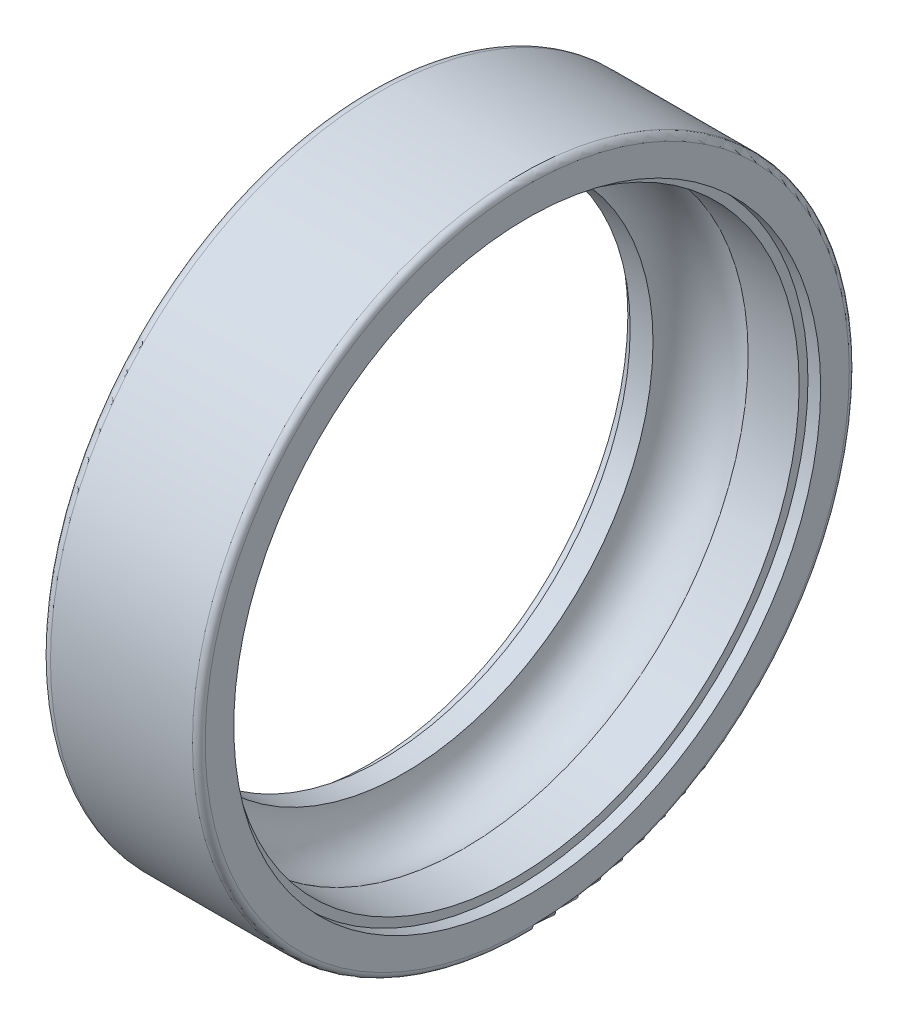
ISO-10303-21;
HEADER;
FILE_DESCRIPTION(('STEP AP214'),'2;1');
FILE_NAME('part.step','',(''),(''),'','','');
FILE_SCHEMA(('AUTOMOTIVE_DESIGN { 1 0 10303 214 1 1 1 1 }'));
ENDSEC;
DATA;
#1=APPLICATION_CONTEXT('core data for automotive mechanical design processes');
#2=APPLICATION_PROTOCOL_DEFINITION('international standard','automotive_design',2000,#1);
#3=PRODUCT_CONTEXT('',#1,'mechanical');
#4=PRODUCT('Part','Part','',(#3));
#5=PRODUCT_RELATED_PRODUCT_CATEGORY('part','',(#4));
#6=PRODUCT_DEFINITION_FORMATION('','',#4);
#7=PRODUCT_DEFINITION_CONTEXT('part definition',#1,'design');
#8=PRODUCT_DEFINITION('design','',#6,#7);
#9=PRODUCT_DEFINITION_SHAPE('','',#8);
#10=(LENGTH_UNIT() NAMED_UNIT(*) SI_UNIT(.MILLI.,.METRE.));
#11=(NAMED_UNIT(*) PLANE_ANGLE_UNIT() SI_UNIT($,.RADIAN.));
#12=(NAMED_UNIT(*) SI_UNIT($,.STERADIAN.) SOLID_ANGLE_UNIT());
#13=UNCERTAINTY_MEASURE_WITH_UNIT(LENGTH_MEASURE(1.E-05),#10,'distance_accuracy_value','');
#14=(GEOMETRIC_REPRESENTATION_CONTEXT(3) GLOBAL_UNCERTAINTY_ASSIGNED_CONTEXT((#13)) GLOBAL_UNIT_ASSIGNED_CONTEXT((#10,
#11,#12)) REPRESENTATION_CONTEXT('',''));
#15=CARTESIAN_POINT('',(0.,0.,0.));
#16=DIRECTION('',(0.,0.,1.));
#17=DIRECTION('',(1.,0.,0.));
#18=AXIS2_PLACEMENT_3D('',#15,#16,#17);
#19=CARTESIAN_POINT('',(0.,30.,0.));
#20=DIRECTION('',(-1.,0.,0.));
#21=DIRECTION('',(0.,0.,1.));
#22=AXIS2_PLACEMENT_3D('',#19,#20,#21);
#23=PLANE('',#22);
#24=CARTESIAN_POINT('',(0.,0.,0.));
#25=DIRECTION('',(1.,0.,0.));
#26=DIRECTION('',(0.,0.,-1.));
#27=AXIS2_PLACEMENT_3D('',#24,#25,#26);
#28=CIRCLE('',#27,24.5);
#29=CARTESIAN_POINT('',(0.,0.,-24.5));
#30=VERTEX_POINT('',#29);
#31=EDGE_CURVE('E56',#30,#30,#28,.T.);
#32=ORIENTED_EDGE('',*,*,#31,.T.);
#33=EDGE_LOOP('',(#32));
#34=FACE_BOUND('',#33,.T.);
#35=CARTESIAN_POINT('',(0.,0.,0.));
#36=DIRECTION('',(1.,0.,0.));
#37=DIRECTION('',(0.,0.,-1.));
#38=AXIS2_PLACEMENT_3D('',#35,#36,#37);
#39=CIRCLE('',#38,30.0000000000008);
#40=CARTESIAN_POINT('',(0.,0.,-30.0000000000008));
#41=VERTEX_POINT('',#40);
#42=EDGE_CURVE('E53',#41,#41,#39,.T.);
#43=ORIENTED_EDGE('',*,*,#42,.F.);
#44=EDGE_LOOP('',(#43));
#45=FACE_BOUND('',#44,.T.);
#46=ADVANCED_FACE('F15',(#34,#45),#23,.T.);
#47=CARTESIAN_POINT('',(15.,0.,0.));
#48=DIRECTION('',(1.,0.,0.));
#49=DIRECTION('',(0.,0.,-1.));
#50=AXIS2_PLACEMENT_3D('',#47,#48,#49);
#51=CYLINDRICAL_SURFACE('',#50,24.5);
#52=CARTESIAN_POINT('',(1.19999999999999,0.,0.));
#53=DIRECTION('',(1.,0.,0.));
#54=DIRECTION('',(0.,0.,-1.));
#55=AXIS2_PLACEMENT_3D('',#52,#53,#54);
#56=CIRCLE('',#55,24.5);
#57=CARTESIAN_POINT('',(1.19999999999999,0.,-24.5));
#58=VERTEX_POINT('',#57);
#59=EDGE_CURVE('E50',#58,#58,#56,.T.);
#60=ORIENTED_EDGE('',*,*,#59,.T.);
#61=EDGE_LOOP('',(#60));
#62=FACE_BOUND('',#61,.T.);
#63=ORIENTED_EDGE('',*,*,#31,.F.);
#64=EDGE_LOOP('',(#63));
#65=FACE_BOUND('',#64,.T.);
#66=ADVANCED_FACE('F62',(#62,#65),#51,.F.);
#67=CARTESIAN_POINT('',(0.999999999999224,0.,0.));
#68=DIRECTION('',(1.,0.,0.));
#69=DIRECTION('',(0.,0.,-1.));
#70=AXIS2_PLACEMENT_3D('',#67,#68,#69);
#71=TOROIDAL_SURFACE('',#70,30.0000000000008,0.99999999999922);
#72=ORIENTED_EDGE('',*,*,#42,.T.);
#73=EDGE_LOOP('',(#72));
#74=FACE_BOUND('',#73,.T.);
#75=CARTESIAN_POINT('',(1.,0.,0.));
#76=DIRECTION('',(1.,0.,0.));
#77=DIRECTION('',(0.,0.,-1.));
#78=AXIS2_PLACEMENT_3D('',#75,#76,#77);
#79=CIRCLE('',#78,31.);
#80=CARTESIAN_POINT('',(1.,0.,-31.));
#81=VERTEX_POINT('',#80);
#82=EDGE_CURVE('E47',#81,#81,#79,.T.);
#83=ORIENTED_EDGE('',*,*,#82,.F.);
#84=EDGE_LOOP('',(#83));
#85=FACE_BOUND('',#84,.T.);
#86=ADVANCED_FACE('F64',(#74,#85),#71,.T.);
#87=CARTESIAN_POINT('',(1.20000000000001,24.5,0.));
#88=DIRECTION('',(-1.,0.,0.));
#89=DIRECTION('',(0.,0.,1.));
#90=AXIS2_PLACEMENT_3D('',#87,#88,#89);
#91=PLANE('',#90);
#92=CARTESIAN_POINT('',(1.19999999999999,0.,0.));
#93=DIRECTION('',(1.,0.,0.));
#94=DIRECTION('',(0.,0.,-1.));
#95=AXIS2_PLACEMENT_3D('',#92,#93,#94);
#96=CIRCLE('',#95,23.52);
#97=CARTESIAN_POINT('',(1.19999999999999,0.,-23.52));
#98=VERTEX_POINT('',#97);
#99=EDGE_CURVE('E44',#98,#98,#96,.T.);
#100=ORIENTED_EDGE('',*,*,#99,.T.);
#101=EDGE_LOOP('',(#100));
#102=FACE_BOUND('',#101,.T.);
#103=ORIENTED_EDGE('',*,*,#59,.F.);
#104=EDGE_LOOP('',(#103));
#105=FACE_BOUND('',#104,.T.);
#106=ADVANCED_FACE('F72',(#102,#105),#91,.T.);
#107=CARTESIAN_POINT('',(15.,0.,0.));
#108=DIRECTION('',(1.,0.,0.));
#109=DIRECTION('',(0.,0.,-1.));
#110=AXIS2_PLACEMENT_3D('',#107,#108,#109);
#111=CYLINDRICAL_SURFACE('',#110,31.);
#112=ORIENTED_EDGE('',*,*,#82,.T.);
#113=EDGE_LOOP('',(#112));
#114=FACE_BOUND('',#113,.T.);
#115=CARTESIAN_POINT('',(14.4,0.,0.));
#116=DIRECTION('',(1.,0.,0.));
#117=DIRECTION('',(0.,0.,-1.));
#118=AXIS2_PLACEMENT_3D('',#115,#116,#117);
#119=CIRCLE('',#118,31.);
#120=CARTESIAN_POINT('',(14.4,0.,-31.));
#121=VERTEX_POINT('',#120);
#122=EDGE_CURVE('E41',#121,#121,#119,.T.);
#123=ORIENTED_EDGE('',*,*,#122,.F.);
#124=EDGE_LOOP('',(#123));
#125=FACE_BOUND('',#124,.T.);
#126=ADVANCED_FACE('F79',(#114,#125),#111,.T.);
#127=CARTESIAN_POINT('',(15.,0.,0.));
#128=DIRECTION('',(1.,0.,0.));
#129=DIRECTION('',(0.,0.,-1.));
#130=AXIS2_PLACEMENT_3D('',#127,#128,#129);
#131=CYLINDRICAL_SURFACE('',#130,23.52);
#132=CARTESIAN_POINT('',(3.3530425611058,0.,0.));
#133=DIRECTION('',(1.,0.,0.));
#134=DIRECTION('',(0.,0.,-1.));
#135=AXIS2_PLACEMENT_3D('',#132,#133,#134);
#136=CIRCLE('',#135,23.52);
#137=CARTESIAN_POINT('',(3.3530425611058,0.,-23.52));
#138=VERTEX_POINT('',#137);
#139=EDGE_CURVE('E38',#138,#138,#136,.T.);
#140=ORIENTED_EDGE('',*,*,#139,.T.);
#141=EDGE_LOOP('',(#140));
#142=FACE_BOUND('',#141,.T.);
#143=ORIENTED_EDGE('',*,*,#99,.F.);
#144=EDGE_LOOP('',(#143));
#145=FACE_BOUND('',#144,.T.);
#146=ADVANCED_FACE('F83',(#142,#145),#131,.F.);
#147=CARTESIAN_POINT('',(14.4000000000002,0.,0.));
#148=DIRECTION('',(1.,0.,0.));
#149=DIRECTION('',(0.,0.,-1.));
#150=AXIS2_PLACEMENT_3D('',#147,#148,#149);
#151=TOROIDAL_SURFACE('',#150,30.4,0.599999999999748);
#152=ORIENTED_EDGE('',*,*,#122,.T.);
#153=EDGE_LOOP('',(#152));
#154=FACE_BOUND('',#153,.T.);
#155=CARTESIAN_POINT('',(15.,0.,0.));
#156=DIRECTION('',(1.,0.,0.));
#157=DIRECTION('',(0.,0.,-1.));
#158=AXIS2_PLACEMENT_3D('',#155,#156,#157);
#159=CIRCLE('',#158,30.4);
#160=CARTESIAN_POINT('',(15.,0.,-30.4));
#161=VERTEX_POINT('',#160);
#162=EDGE_CURVE('E35',#161,#161,#159,.T.);
#163=ORIENTED_EDGE('',*,*,#162,.F.);
#164=EDGE_LOOP('',(#163));
#165=FACE_BOUND('',#164,.T.);
#166=ADVANCED_FACE('F87',(#154,#165),#151,.T.);
#167=CARTESIAN_POINT('',(7.49999999999945,0.,0.));
#168=DIRECTION('',(1.,0.,0.));
#169=DIRECTION('',(0.,0.,-1.));
#170=AXIS2_PLACEMENT_3D('',#167,#168,#169);
#171=TOROIDAL_SURFACE('',#170,22.9570000000009,4.18499999999932);
#172=ORIENTED_EDGE('',*,*,#139,.F.);
#173=EDGE_LOOP('',(#172));
#174=FACE_BOUND('',#173,.T.);
#175=CARTESIAN_POINT('',(8.98676864373719,0.,0.));
#176=DIRECTION('',(1.,0.,0.));
#177=DIRECTION('',(0.,0.,-1.));
#178=AXIS2_PLACEMENT_3D('',#175,#176,#177);
#179=CIRCLE('',#178,26.869);
#180=CARTESIAN_POINT('',(8.98676864373719,0.,-26.869));
#181=VERTEX_POINT('',#180);
#182=EDGE_CURVE('E30',#181,#181,#179,.T.);
#183=ORIENTED_EDGE('',*,*,#182,.T.);
#184=EDGE_LOOP('',(#183));
#185=FACE_BOUND('',#184,.T.);
#186=ADVANCED_FACE('F91',(#174,#185),#171,.F.);
#187=CARTESIAN_POINT('',(15.,27.7,0.));
#188=DIRECTION('',(1.,0.,0.));
#189=DIRECTION('',(0.,0.,-1.));
#190=AXIS2_PLACEMENT_3D('',#187,#188,#189);
#191=PLANE('',#190);
#192=ORIENTED_EDGE('',*,*,#162,.T.);
#193=EDGE_LOOP('',(#192));
#194=FACE_BOUND('',#193,.T.);
#195=CARTESIAN_POINT('',(15.,0.,0.));
#196=DIRECTION('',(1.,0.,0.));
#197=DIRECTION('',(0.,0.,-1.));
#198=AXIS2_PLACEMENT_3D('',#195,#196,#197);
#199=CIRCLE('',#198,27.7);
#200=CARTESIAN_POINT('',(15.,0.,-27.7));
#201=VERTEX_POINT('',#200);
#202=EDGE_CURVE('E26',#201,#201,#199,.T.);
#203=ORIENTED_EDGE('',*,*,#202,.F.);
#204=EDGE_LOOP('',(#203));
#205=FACE_BOUND('',#204,.T.);
#206=ADVANCED_FACE('F95',(#194,#205),#191,.T.);
#207=CARTESIAN_POINT('',(15.,0.,0.));
#208=DIRECTION('',(1.,0.,0.));
#209=DIRECTION('',(0.,0.,-1.));
#210=AXIS2_PLACEMENT_3D('',#207,#208,#209);
#211=CYLINDRICAL_SURFACE('',#210,26.869);
#212=CARTESIAN_POINT('',(13.8,0.,0.));
#213=DIRECTION('',(1.,0.,0.));
#214=DIRECTION('',(0.,0.,-1.));
#215=AXIS2_PLACEMENT_3D('',#212,#213,#214);
#216=CIRCLE('',#215,26.869);
#217=CARTESIAN_POINT('',(13.8,0.,-26.869));
#218=VERTEX_POINT('',#217);
#219=EDGE_CURVE('E22',#218,#218,#216,.T.);
#220=ORIENTED_EDGE('',*,*,#219,.T.);
#221=EDGE_LOOP('',(#220));
#222=FACE_BOUND('',#221,.T.);
#223=ORIENTED_EDGE('',*,*,#182,.F.);
#224=EDGE_LOOP('',(#223));
#225=FACE_BOUND('',#224,.T.);
#226=ADVANCED_FACE('F99',(#222,#225),#211,.F.);
#227=CARTESIAN_POINT('',(15.,0.,0.));
#228=DIRECTION('',(1.,0.,0.));
#229=DIRECTION('',(0.,0.,-1.));
#230=AXIS2_PLACEMENT_3D('',#227,#228,#229);
#231=CYLINDRICAL_SURFACE('',#230,27.7);
#232=ORIENTED_EDGE('',*,*,#202,.T.);
#233=EDGE_LOOP('',(#232));
#234=FACE_BOUND('',#233,.T.);
#235=CARTESIAN_POINT('',(13.8,0.,0.));
#236=DIRECTION('',(1.,0.,0.));
#237=DIRECTION('',(0.,0.,-1.));
#238=AXIS2_PLACEMENT_3D('',#235,#236,#237);
#239=CIRCLE('',#238,27.7);
#240=CARTESIAN_POINT('',(13.8,0.,-27.7));
#241=VERTEX_POINT('',#240);
#242=EDGE_CURVE('E10',#241,#241,#239,.T.);
#243=ORIENTED_EDGE('',*,*,#242,.F.);
#244=EDGE_LOOP('',(#243));
#245=FACE_BOUND('',#244,.T.);
#246=ADVANCED_FACE('F102',(#234,#245),#231,.F.);
#247=CARTESIAN_POINT('',(13.8,26.869,0.));
#248=DIRECTION('',(1.,0.,0.));
#249=DIRECTION('',(0.,0.,-1.));
#250=AXIS2_PLACEMENT_3D('',#247,#248,#249);
#251=PLANE('',#250);
#252=ORIENTED_EDGE('',*,*,#242,.T.);
#253=EDGE_LOOP('',(#252));
#254=FACE_BOUND('',#253,.T.);
#255=ORIENTED_EDGE('',*,*,#219,.F.);
#256=EDGE_LOOP('',(#255));
#257=FACE_BOUND('',#256,.T.);
#258=ADVANCED_FACE('F17',(#254,#257),#251,.T.);
#259=CLOSED_SHELL('',(#46,#66,#86,#106,#126,#146,#166,#186,#206,#226,#246,#258));
#260=MANIFOLD_SOLID_BREP('B1',#259);
#261=ADVANCED_BREP_SHAPE_REPRESENTATION('',(#18,#260),#14);
#262=SHAPE_DEFINITION_REPRESENTATION(#9,#261);
ENDSEC;
END-ISO-10303-21;
